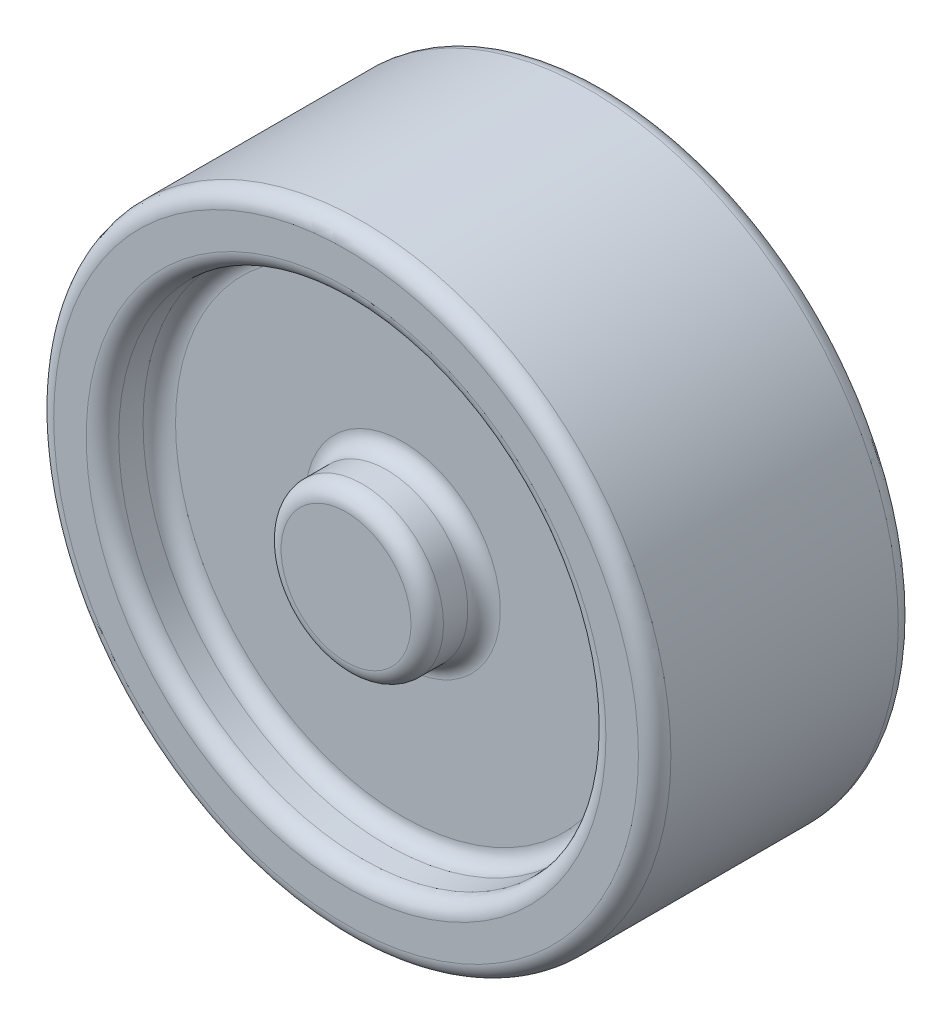
ISO-10303-21;
HEADER;
FILE_DESCRIPTION(('STEP AP214'),'2;1');
FILE_NAME('part.step','',(''),(''),'','','');
FILE_SCHEMA(('AUTOMOTIVE_DESIGN { 1 0 10303 214 1 1 1 1 }'));
ENDSEC;
DATA;
#1=APPLICATION_CONTEXT('core data for automotive mechanical design processes');
#2=APPLICATION_PROTOCOL_DEFINITION('international standard','automotive_design',2000,#1);
#3=PRODUCT_CONTEXT('',#1,'mechanical');
#4=PRODUCT('Part','Part','',(#3));
#5=PRODUCT_RELATED_PRODUCT_CATEGORY('part','',(#4));
#6=PRODUCT_DEFINITION_FORMATION('','',#4);
#7=PRODUCT_DEFINITION_CONTEXT('part definition',#1,'design');
#8=PRODUCT_DEFINITION('design','',#6,#7);
#9=PRODUCT_DEFINITION_SHAPE('','',#8);
#10=(LENGTH_UNIT() NAMED_UNIT(*) SI_UNIT(.MILLI.,.METRE.));
#11=(NAMED_UNIT(*) PLANE_ANGLE_UNIT() SI_UNIT($,.RADIAN.));
#12=(NAMED_UNIT(*) SI_UNIT($,.STERADIAN.) SOLID_ANGLE_UNIT());
#13=UNCERTAINTY_MEASURE_WITH_UNIT(LENGTH_MEASURE(1.E-05),#10,'distance_accuracy_value','');
#14=(GEOMETRIC_REPRESENTATION_CONTEXT(3) GLOBAL_UNCERTAINTY_ASSIGNED_CONTEXT((#13)) GLOBAL_UNIT_ASSIGNED_CONTEXT((#10,
#11,#12)) REPRESENTATION_CONTEXT('',''));
#15=CARTESIAN_POINT('',(0.,0.,0.));
#16=DIRECTION('',(0.,0.,1.));
#17=DIRECTION('',(1.,0.,0.));
#18=AXIS2_PLACEMENT_3D('',#15,#16,#17);
#19=CARTESIAN_POINT('',(0.,0.,-8.));
#20=DIRECTION('',(0.,0.,1.));
#21=DIRECTION('',(-1.,0.,0.));
#22=AXIS2_PLACEMENT_3D('',#19,#20,#21);
#23=CYLINDRICAL_SURFACE('',#22,19.);
#24=CARTESIAN_POINT('',(0.,0.,7.));
#25=DIRECTION('',(0.,0.,1.));
#26=DIRECTION('',(1.,0.,0.));
#27=AXIS2_PLACEMENT_3D('',#24,#25,#26);
#28=CIRCLE('',#27,19.);
#29=CARTESIAN_POINT('',(19.,0.,7.));
#30=VERTEX_POINT('',#29);
#31=EDGE_CURVE('E103',#30,#30,#28,.T.);
#32=ORIENTED_EDGE('',*,*,#31,.F.);
#33=EDGE_LOOP('',(#32));
#34=FACE_BOUND('',#33,.T.);
#35=CARTESIAN_POINT('',(0.,0.,-7.));
#36=DIRECTION('',(0.,0.,1.));
#37=DIRECTION('',(1.,0.,0.));
#38=AXIS2_PLACEMENT_3D('',#35,#36,#37);
#39=CIRCLE('',#38,19.);
#40=CARTESIAN_POINT('',(19.,0.,-7.));
#41=VERTEX_POINT('',#40);
#42=EDGE_CURVE('E106',#41,#41,#39,.F.);
#43=ORIENTED_EDGE('',*,*,#42,.F.);
#44=EDGE_LOOP('',(#43));
#45=FACE_BOUND('',#44,.T.);
#46=ADVANCED_FACE('F41',(#34,#45),#23,.T.);
#47=CARTESIAN_POINT('',(0.,0.,-8.));
#48=DIRECTION('',(0.,0.,-1.));
#49=DIRECTION('',(1.,0.,0.));
#50=AXIS2_PLACEMENT_3D('',#47,#48,#49);
#51=PLANE('',#50);
#52=CARTESIAN_POINT('',(0.,0.,-8.));
#53=DIRECTION('',(0.,0.,1.));
#54=DIRECTION('',(1.,0.,0.));
#55=AXIS2_PLACEMENT_3D('',#52,#53,#54);
#56=CIRCLE('',#55,16.);
#57=CARTESIAN_POINT('',(16.,0.,-8.));
#58=VERTEX_POINT('',#57);
#59=EDGE_CURVE('E10',#58,#58,#56,.F.);
#60=ORIENTED_EDGE('',*,*,#59,.F.);
#61=EDGE_LOOP('',(#60));
#62=FACE_BOUND('',#61,.T.);
#63=CARTESIAN_POINT('',(0.,0.,-8.));
#64=DIRECTION('',(0.,0.,1.));
#65=DIRECTION('',(1.,0.,0.));
#66=AXIS2_PLACEMENT_3D('',#63,#64,#65);
#67=CIRCLE('',#66,18.);
#68=CARTESIAN_POINT('',(18.,0.,-8.));
#69=VERTEX_POINT('',#68);
#70=EDGE_CURVE('E97',#69,#69,#67,.T.);
#71=ORIENTED_EDGE('',*,*,#70,.F.);
#72=EDGE_LOOP('',(#71));
#73=FACE_BOUND('',#72,.T.);
#74=ADVANCED_FACE('F114',(#62,#73),#51,.T.);
#75=CARTESIAN_POINT('',(0.,0.,8.));
#76=DIRECTION('',(0.,0.,-1.));
#77=DIRECTION('',(1.,0.,0.));
#78=AXIS2_PLACEMENT_3D('',#75,#76,#77);
#79=PLANE('',#78);
#80=CARTESIAN_POINT('',(0.,0.,8.));
#81=DIRECTION('',(0.,0.,1.));
#82=DIRECTION('',(1.,0.,0.));
#83=AXIS2_PLACEMENT_3D('',#80,#81,#82);
#84=CIRCLE('',#83,16.);
#85=CARTESIAN_POINT('',(16.,0.,8.));
#86=VERTEX_POINT('',#85);
#87=EDGE_CURVE('E73',#86,#86,#84,.T.);
#88=ORIENTED_EDGE('',*,*,#87,.F.);
#89=EDGE_LOOP('',(#88));
#90=FACE_BOUND('',#89,.T.);
#91=CARTESIAN_POINT('',(0.,0.,8.));
#92=DIRECTION('',(0.,0.,1.));
#93=DIRECTION('',(1.,0.,0.));
#94=AXIS2_PLACEMENT_3D('',#91,#92,#93);
#95=CIRCLE('',#94,18.);
#96=CARTESIAN_POINT('',(18.,0.,8.));
#97=VERTEX_POINT('',#96);
#98=EDGE_CURVE('E100',#97,#97,#95,.F.);
#99=ORIENTED_EDGE('',*,*,#98,.F.);
#100=EDGE_LOOP('',(#99));
#101=FACE_BOUND('',#100,.T.);
#102=ADVANCED_FACE('F122',(#90,#101),#79,.F.);
#103=CARTESIAN_POINT('',(0.,0.,7.));
#104=DIRECTION('',(0.,0.,-1.));
#105=DIRECTION('',(1.,0.,0.));
#106=AXIS2_PLACEMENT_3D('',#103,#104,#105);
#107=TOROIDAL_SURFACE('',#106,18.,1.);
#108=ORIENTED_EDGE('',*,*,#98,.T.);
#109=EDGE_LOOP('',(#108));
#110=FACE_BOUND('',#109,.T.);
#111=ORIENTED_EDGE('',*,*,#31,.T.);
#112=EDGE_LOOP('',(#111));
#113=FACE_BOUND('',#112,.T.);
#114=ADVANCED_FACE('F129',(#110,#113),#107,.T.);
#115=CARTESIAN_POINT('',(0.,0.,-7.));
#116=DIRECTION('',(0.,0.,-1.));
#117=DIRECTION('',(1.,0.,0.));
#118=AXIS2_PLACEMENT_3D('',#115,#116,#117);
#119=TOROIDAL_SURFACE('',#118,18.,1.);
#120=ORIENTED_EDGE('',*,*,#42,.T.);
#121=EDGE_LOOP('',(#120));
#122=FACE_BOUND('',#121,.T.);
#123=ORIENTED_EDGE('',*,*,#70,.T.);
#124=EDGE_LOOP('',(#123));
#125=FACE_BOUND('',#124,.T.);
#126=ADVANCED_FACE('F110',(#122,#125),#119,.T.);
#127=CARTESIAN_POINT('',(0.,0.,-4.5));
#128=DIRECTION('',(0.,0.,-1.));
#129=DIRECTION('',(1.,0.,0.));
#130=AXIS2_PLACEMENT_3D('',#127,#128,#129);
#131=CYLINDRICAL_SURFACE('',#130,15.);
#132=CARTESIAN_POINT('',(0.,0.,-5.5));
#133=DIRECTION('',(0.,0.,1.));
#134=DIRECTION('',(1.,0.,0.));
#135=AXIS2_PLACEMENT_3D('',#132,#133,#134);
#136=CIRCLE('',#135,15.);
#137=CARTESIAN_POINT('',(15.,0.,-5.5));
#138=VERTEX_POINT('',#137);
#139=EDGE_CURVE('E48',#138,#138,#136,.F.);
#140=ORIENTED_EDGE('',*,*,#139,.F.);
#141=EDGE_LOOP('',(#140));
#142=FACE_BOUND('',#141,.T.);
#143=CARTESIAN_POINT('',(0.,0.,-7.));
#144=DIRECTION('',(0.,0.,1.));
#145=DIRECTION('',(1.,0.,0.));
#146=AXIS2_PLACEMENT_3D('',#143,#144,#145);
#147=CIRCLE('',#146,15.);
#148=CARTESIAN_POINT('',(15.,0.,-7.));
#149=VERTEX_POINT('',#148);
#150=EDGE_CURVE('E52',#149,#149,#147,.T.);
#151=ORIENTED_EDGE('',*,*,#150,.F.);
#152=EDGE_LOOP('',(#151));
#153=FACE_BOUND('',#152,.T.);
#154=ADVANCED_FACE('F135',(#142,#153),#131,.F.);
#155=CARTESIAN_POINT('',(0.,0.,-4.5));
#156=DIRECTION('',(0.,0.,-1.));
#157=DIRECTION('',(1.,0.,0.));
#158=AXIS2_PLACEMENT_3D('',#155,#156,#157);
#159=PLANE('',#158);
#160=CARTESIAN_POINT('',(0.,0.,-4.5));
#161=DIRECTION('',(0.,0.,1.));
#162=DIRECTION('',(1.,0.,0.));
#163=AXIS2_PLACEMENT_3D('',#160,#161,#162);
#164=CIRCLE('',#163,6.);
#165=CARTESIAN_POINT('',(6.,0.,-4.5));
#166=VERTEX_POINT('',#165);
#167=EDGE_CURVE('E61',#166,#166,#164,.F.);
#168=ORIENTED_EDGE('',*,*,#167,.F.);
#169=EDGE_LOOP('',(#168));
#170=FACE_BOUND('',#169,.T.);
#171=CARTESIAN_POINT('',(0.,0.,-4.5));
#172=DIRECTION('',(0.,0.,1.));
#173=DIRECTION('',(1.,0.,0.));
#174=AXIS2_PLACEMENT_3D('',#171,#172,#173);
#175=CIRCLE('',#174,14.);
#176=CARTESIAN_POINT('',(14.,0.,-4.5));
#177=VERTEX_POINT('',#176);
#178=EDGE_CURVE('E64',#177,#177,#175,.T.);
#179=ORIENTED_EDGE('',*,*,#178,.F.);
#180=EDGE_LOOP('',(#179));
#181=FACE_BOUND('',#180,.T.);
#182=ADVANCED_FACE('F168',(#170,#181),#159,.T.);
#183=CARTESIAN_POINT('',(0.,0.,-4.5));
#184=DIRECTION('',(0.,0.,-1.));
#185=DIRECTION('',(1.,0.,0.));
#186=AXIS2_PLACEMENT_3D('',#183,#184,#185);
#187=CYLINDRICAL_SURFACE('',#186,5.);
#188=CARTESIAN_POINT('',(0.,0.,-5.5));
#189=DIRECTION('',(0.,0.,1.));
#190=DIRECTION('',(1.,0.,0.));
#191=AXIS2_PLACEMENT_3D('',#188,#189,#190);
#192=CIRCLE('',#191,5.);
#193=CARTESIAN_POINT('',(5.,0.,-5.5));
#194=VERTEX_POINT('',#193);
#195=EDGE_CURVE('E67',#194,#194,#192,.T.);
#196=ORIENTED_EDGE('',*,*,#195,.F.);
#197=EDGE_LOOP('',(#196));
#198=FACE_BOUND('',#197,.T.);
#199=CARTESIAN_POINT('',(0.,0.,-7.));
#200=DIRECTION('',(0.,0.,1.));
#201=DIRECTION('',(1.,0.,0.));
#202=AXIS2_PLACEMENT_3D('',#199,#200,#201);
#203=CIRCLE('',#202,5.);
#204=CARTESIAN_POINT('',(5.,0.,-7.));
#205=VERTEX_POINT('',#204);
#206=EDGE_CURVE('E70',#205,#205,#203,.F.);
#207=ORIENTED_EDGE('',*,*,#206,.F.);
#208=EDGE_LOOP('',(#207));
#209=FACE_BOUND('',#208,.T.);
#210=ADVANCED_FACE('F170',(#198,#209),#187,.T.);
#211=CARTESIAN_POINT('',(0.,0.,-8.));
#212=DIRECTION('',(0.,0.,1.));
#213=DIRECTION('',(1.,0.,0.));
#214=AXIS2_PLACEMENT_3D('',#211,#212,#213);
#215=CIRCLE('',#214,4.);
#216=CARTESIAN_POINT('',(4.,0.,-8.));
#217=VERTEX_POINT('',#216);
#218=EDGE_CURVE('E56',#217,#217,#215,.T.);
#219=ORIENTED_EDGE('',*,*,#218,.F.);
#220=EDGE_LOOP('',(#219));
#221=FACE_BOUND('',#220,.T.);
#222=ADVANCED_FACE('F125',(#221),#51,.T.);
#223=CARTESIAN_POINT('',(0.,0.,4.5));
#224=DIRECTION('',(0.,0.,1.));
#225=DIRECTION('',(1.,0.,0.));
#226=AXIS2_PLACEMENT_3D('',#223,#224,#225);
#227=PLANE('',#226);
#228=CARTESIAN_POINT('',(0.,0.,4.5));
#229=DIRECTION('',(0.,0.,-1.));
#230=DIRECTION('',(-1.,0.,0.));
#231=AXIS2_PLACEMENT_3D('',#228,#229,#230);
#232=CIRCLE('',#231,6.);
#233=CARTESIAN_POINT('',(-6.,0.,4.5));
#234=VERTEX_POINT('',#233);
#235=EDGE_CURVE('E82',#234,#234,#232,.F.);
#236=ORIENTED_EDGE('',*,*,#235,.F.);
#237=EDGE_LOOP('',(#236));
#238=FACE_BOUND('',#237,.T.);
#239=CARTESIAN_POINT('',(0.,0.,4.5));
#240=DIRECTION('',(0.,0.,-1.));
#241=DIRECTION('',(-1.,0.,0.));
#242=AXIS2_PLACEMENT_3D('',#239,#240,#241);
#243=CIRCLE('',#242,14.);
#244=CARTESIAN_POINT('',(-14.,0.,4.5));
#245=VERTEX_POINT('',#244);
#246=EDGE_CURVE('E85',#245,#245,#243,.T.);
#247=ORIENTED_EDGE('',*,*,#246,.F.);
#248=EDGE_LOOP('',(#247));
#249=FACE_BOUND('',#248,.T.);
#250=ADVANCED_FACE('F188',(#238,#249),#227,.T.);
#251=CARTESIAN_POINT('',(0.,0.,4.5));
#252=DIRECTION('',(0.,0.,1.));
#253=DIRECTION('',(-1.,0.,0.));
#254=AXIS2_PLACEMENT_3D('',#251,#252,#253);
#255=CYLINDRICAL_SURFACE('',#254,15.);
#256=CARTESIAN_POINT('',(0.,0.,5.5));
#257=DIRECTION('',(0.,0.,-1.));
#258=DIRECTION('',(-1.,0.,0.));
#259=AXIS2_PLACEMENT_3D('',#256,#257,#258);
#260=CIRCLE('',#259,15.);
#261=CARTESIAN_POINT('',(-15.,0.,5.5));
#262=VERTEX_POINT('',#261);
#263=EDGE_CURVE('E76',#262,#262,#260,.F.);
#264=ORIENTED_EDGE('',*,*,#263,.F.);
#265=EDGE_LOOP('',(#264));
#266=FACE_BOUND('',#265,.T.);
#267=CARTESIAN_POINT('',(0.,0.,7.));
#268=DIRECTION('',(0.,0.,1.));
#269=DIRECTION('',(1.,0.,0.));
#270=AXIS2_PLACEMENT_3D('',#267,#268,#269);
#271=CIRCLE('',#270,15.);
#272=CARTESIAN_POINT('',(15.,0.,7.));
#273=VERTEX_POINT('',#272);
#274=EDGE_CURVE('E79',#273,#273,#271,.F.);
#275=ORIENTED_EDGE('',*,*,#274,.F.);
#276=EDGE_LOOP('',(#275));
#277=FACE_BOUND('',#276,.T.);
#278=ADVANCED_FACE('F184',(#266,#277),#255,.F.);
#279=CARTESIAN_POINT('',(0.,0.,4.5));
#280=DIRECTION('',(0.,0.,1.));
#281=DIRECTION('',(-1.,0.,0.));
#282=AXIS2_PLACEMENT_3D('',#279,#280,#281);
#283=CYLINDRICAL_SURFACE('',#282,5.);
#284=CARTESIAN_POINT('',(0.,0.,7.));
#285=DIRECTION('',(0.,0.,1.));
#286=DIRECTION('',(1.,0.,0.));
#287=AXIS2_PLACEMENT_3D('',#284,#285,#286);
#288=CIRCLE('',#287,5.);
#289=CARTESIAN_POINT('',(5.,0.,7.));
#290=VERTEX_POINT('',#289);
#291=EDGE_CURVE('E91',#290,#290,#288,.T.);
#292=ORIENTED_EDGE('',*,*,#291,.F.);
#293=EDGE_LOOP('',(#292));
#294=FACE_BOUND('',#293,.T.);
#295=CARTESIAN_POINT('',(0.,0.,5.5));
#296=DIRECTION('',(0.,0.,-1.));
#297=DIRECTION('',(-1.,0.,0.));
#298=AXIS2_PLACEMENT_3D('',#295,#296,#297);
#299=CIRCLE('',#298,5.);
#300=CARTESIAN_POINT('',(-5.,0.,5.5));
#301=VERTEX_POINT('',#300);
#302=EDGE_CURVE('E94',#301,#301,#299,.T.);
#303=ORIENTED_EDGE('',*,*,#302,.F.);
#304=EDGE_LOOP('',(#303));
#305=FACE_BOUND('',#304,.T.);
#306=ADVANCED_FACE('F187',(#294,#305),#283,.T.);
#307=CARTESIAN_POINT('',(0.,0.,8.));
#308=DIRECTION('',(0.,0.,1.));
#309=DIRECTION('',(1.,0.,0.));
#310=AXIS2_PLACEMENT_3D('',#307,#308,#309);
#311=CIRCLE('',#310,4.);
#312=CARTESIAN_POINT('',(4.,0.,8.));
#313=VERTEX_POINT('',#312);
#314=EDGE_CURVE('E88',#313,#313,#311,.F.);
#315=ORIENTED_EDGE('',*,*,#314,.F.);
#316=EDGE_LOOP('',(#315));
#317=FACE_BOUND('',#316,.T.);
#318=ADVANCED_FACE('F140',(#317),#79,.F.);
#319=CARTESIAN_POINT('',(0.,0.,7.));
#320=DIRECTION('',(0.,0.,-1.));
#321=DIRECTION('',(1.,0.,0.));
#322=AXIS2_PLACEMENT_3D('',#319,#320,#321);
#323=TOROIDAL_SURFACE('',#322,4.,1.);
#324=ORIENTED_EDGE('',*,*,#314,.T.);
#325=EDGE_LOOP('',(#324));
#326=FACE_BOUND('',#325,.T.);
#327=ORIENTED_EDGE('',*,*,#291,.T.);
#328=EDGE_LOOP('',(#327));
#329=FACE_BOUND('',#328,.T.);
#330=ADVANCED_FACE('F136',(#326,#329),#323,.T.);
#331=CARTESIAN_POINT('',(0.,0.,5.5));
#332=DIRECTION('',(0.,0.,1.));
#333=DIRECTION('',(-1.,0.,0.));
#334=AXIS2_PLACEMENT_3D('',#331,#332,#333);
#335=TOROIDAL_SURFACE('',#334,6.,1.);
#336=ORIENTED_EDGE('',*,*,#302,.T.);
#337=EDGE_LOOP('',(#336));
#338=FACE_BOUND('',#337,.T.);
#339=ORIENTED_EDGE('',*,*,#235,.T.);
#340=EDGE_LOOP('',(#339));
#341=FACE_BOUND('',#340,.T.);
#342=ADVANCED_FACE('F139',(#338,#341),#335,.F.);
#343=CARTESIAN_POINT('',(0.,0.,5.5));
#344=DIRECTION('',(0.,0.,1.));
#345=DIRECTION('',(-1.,0.,0.));
#346=AXIS2_PLACEMENT_3D('',#343,#344,#345);
#347=TOROIDAL_SURFACE('',#346,14.,1.);
#348=ORIENTED_EDGE('',*,*,#246,.T.);
#349=EDGE_LOOP('',(#348));
#350=FACE_BOUND('',#349,.T.);
#351=ORIENTED_EDGE('',*,*,#263,.T.);
#352=EDGE_LOOP('',(#351));
#353=FACE_BOUND('',#352,.T.);
#354=ADVANCED_FACE('F144',(#350,#353),#347,.F.);
#355=CARTESIAN_POINT('',(0.,0.,7.));
#356=DIRECTION('',(0.,0.,-1.));
#357=DIRECTION('',(1.,0.,0.));
#358=AXIS2_PLACEMENT_3D('',#355,#356,#357);
#359=TOROIDAL_SURFACE('',#358,16.,1.);
#360=ORIENTED_EDGE('',*,*,#274,.T.);
#361=EDGE_LOOP('',(#360));
#362=FACE_BOUND('',#361,.T.);
#363=ORIENTED_EDGE('',*,*,#87,.T.);
#364=EDGE_LOOP('',(#363));
#365=FACE_BOUND('',#364,.T.);
#366=ADVANCED_FACE('F148',(#362,#365),#359,.T.);
#367=CARTESIAN_POINT('',(0.,0.,-5.5));
#368=DIRECTION('',(0.,0.,-1.));
#369=DIRECTION('',(1.,0.,0.));
#370=AXIS2_PLACEMENT_3D('',#367,#368,#369);
#371=TOROIDAL_SURFACE('',#370,6.,1.);
#372=ORIENTED_EDGE('',*,*,#167,.T.);
#373=EDGE_LOOP('',(#372));
#374=FACE_BOUND('',#373,.T.);
#375=ORIENTED_EDGE('',*,*,#195,.T.);
#376=EDGE_LOOP('',(#375));
#377=FACE_BOUND('',#376,.T.);
#378=ADVANCED_FACE('F152',(#374,#377),#371,.F.);
#379=CARTESIAN_POINT('',(0.,0.,-7.));
#380=DIRECTION('',(0.,0.,-1.));
#381=DIRECTION('',(1.,0.,0.));
#382=AXIS2_PLACEMENT_3D('',#379,#380,#381);
#383=TOROIDAL_SURFACE('',#382,4.,1.);
#384=ORIENTED_EDGE('',*,*,#206,.T.);
#385=EDGE_LOOP('',(#384));
#386=FACE_BOUND('',#385,.T.);
#387=ORIENTED_EDGE('',*,*,#218,.T.);
#388=EDGE_LOOP('',(#387));
#389=FACE_BOUND('',#388,.T.);
#390=ADVANCED_FACE('F156',(#386,#389),#383,.T.);
#391=CARTESIAN_POINT('',(0.,0.,-5.5));
#392=DIRECTION('',(0.,0.,-1.));
#393=DIRECTION('',(1.,0.,0.));
#394=AXIS2_PLACEMENT_3D('',#391,#392,#393);
#395=TOROIDAL_SURFACE('',#394,14.,1.);
#396=ORIENTED_EDGE('',*,*,#139,.T.);
#397=EDGE_LOOP('',(#396));
#398=FACE_BOUND('',#397,.T.);
#399=ORIENTED_EDGE('',*,*,#178,.T.);
#400=EDGE_LOOP('',(#399));
#401=FACE_BOUND('',#400,.T.);
#402=ADVANCED_FACE('F159',(#398,#401),#395,.F.);
#403=CARTESIAN_POINT('',(0.,0.,-7.));
#404=DIRECTION('',(0.,0.,-1.));
#405=DIRECTION('',(1.,0.,0.));
#406=AXIS2_PLACEMENT_3D('',#403,#404,#405);
#407=TOROIDAL_SURFACE('',#406,16.,1.);
#408=ORIENTED_EDGE('',*,*,#59,.T.);
#409=EDGE_LOOP('',(#408));
#410=FACE_BOUND('',#409,.T.);
#411=ORIENTED_EDGE('',*,*,#150,.T.);
#412=EDGE_LOOP('',(#411));
#413=FACE_BOUND('',#412,.T.);
#414=ADVANCED_FACE('F43',(#410,#413),#407,.T.);
#415=CLOSED_SHELL('',(#46,#74,#102,#114,#126,#154,#182,#210,#222,#250,#278,#306,#318,#330,#342,
#354,#366,#378,#390,#402,#414));
#416=MANIFOLD_SOLID_BREP('B2',#415);
#417=ADVANCED_BREP_SHAPE_REPRESENTATION('',(#18,#416),#14);
#418=SHAPE_DEFINITION_REPRESENTATION(#9,#417);
ENDSEC;
END-ISO-10303-21;
